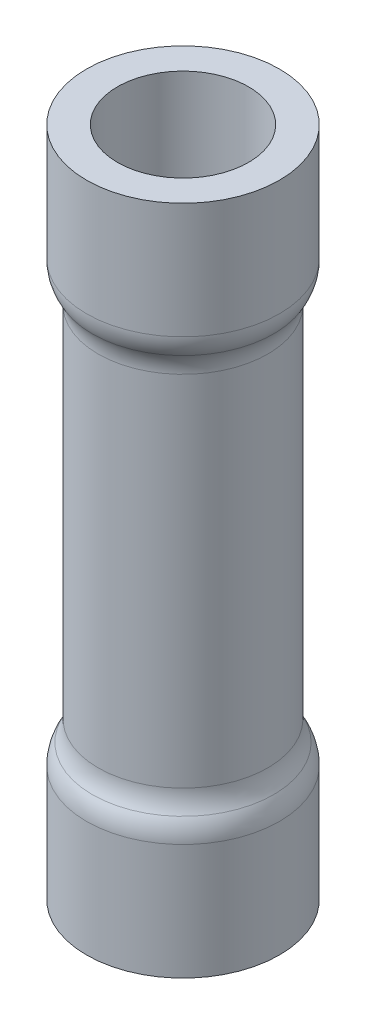
ISO-10303-21;
HEADER;
FILE_DESCRIPTION(('STEP AP214'),'2;1');
FILE_NAME('part.step','',(''),(''),'','','');
FILE_SCHEMA(('AUTOMOTIVE_DESIGN { 1 0 10303 214 1 1 1 1 }'));
ENDSEC;
DATA;
#1=APPLICATION_CONTEXT('core data for automotive mechanical design processes');
#2=APPLICATION_PROTOCOL_DEFINITION('international standard','automotive_design',2000,#1);
#3=PRODUCT_CONTEXT('',#1,'mechanical');
#4=PRODUCT('Part','Part','',(#3));
#5=PRODUCT_RELATED_PRODUCT_CATEGORY('part','',(#4));
#6=PRODUCT_DEFINITION_FORMATION('','',#4);
#7=PRODUCT_DEFINITION_CONTEXT('part definition',#1,'design');
#8=PRODUCT_DEFINITION('design','',#6,#7);
#9=PRODUCT_DEFINITION_SHAPE('','',#8);
#10=(LENGTH_UNIT() NAMED_UNIT(*) SI_UNIT(.MILLI.,.METRE.));
#11=(NAMED_UNIT(*) PLANE_ANGLE_UNIT() SI_UNIT($,.RADIAN.));
#12=(NAMED_UNIT(*) SI_UNIT($,.STERADIAN.) SOLID_ANGLE_UNIT());
#13=UNCERTAINTY_MEASURE_WITH_UNIT(LENGTH_MEASURE(1.E-05),#10,'distance_accuracy_value','');
#14=(GEOMETRIC_REPRESENTATION_CONTEXT(3) GLOBAL_UNCERTAINTY_ASSIGNED_CONTEXT((#13)) GLOBAL_UNIT_ASSIGNED_CONTEXT((#10,
#11,#12)) REPRESENTATION_CONTEXT('',''));
#15=CARTESIAN_POINT('',(0.,0.,0.));
#16=DIRECTION('',(0.,0.,1.));
#17=DIRECTION('',(1.,0.,0.));
#18=AXIS2_PLACEMENT_3D('',#15,#16,#17);
#19=CARTESIAN_POINT('',(0.,22.098,0.));
#20=DIRECTION('',(0.,1.,0.));
#21=DIRECTION('',(0.,0.,1.));
#22=AXIS2_PLACEMENT_3D('',#19,#20,#21);
#23=CYLINDRICAL_SURFACE('',#22,3.175);
#24=CARTESIAN_POINT('',(0.,22.098,0.));
#25=DIRECTION('',(0.,1.,0.));
#26=DIRECTION('',(0.,0.,1.));
#27=AXIS2_PLACEMENT_3D('',#24,#25,#26);
#28=CIRCLE('',#27,3.175);
#29=CARTESIAN_POINT('',(0.,22.098,3.175));
#30=VERTEX_POINT('',#29);
#31=EDGE_CURVE('E10',#30,#30,#28,.T.);
#32=ORIENTED_EDGE('',*,*,#31,.F.);
#33=EDGE_LOOP('',(#32));
#34=FACE_BOUND('',#33,.T.);
#35=CARTESIAN_POINT('',(0.,18.288,0.));
#36=DIRECTION('',(0.,1.,0.));
#37=DIRECTION('',(0.,0.,1.));
#38=AXIS2_PLACEMENT_3D('',#35,#36,#37);
#39=CIRCLE('',#38,3.175);
#40=CARTESIAN_POINT('',(0.,18.288,3.175));
#41=VERTEX_POINT('',#40);
#42=EDGE_CURVE('E84',#41,#41,#39,.T.);
#43=ORIENTED_EDGE('',*,*,#42,.T.);
#44=EDGE_LOOP('',(#43));
#45=FACE_BOUND('',#44,.T.);
#46=ADVANCED_FACE('F32',(#34,#45),#23,.T.);
#47=CARTESIAN_POINT('',(2.159,22.098,0.));
#48=DIRECTION('',(0.,1.,0.));
#49=DIRECTION('',(0.,0.,1.));
#50=AXIS2_PLACEMENT_3D('',#47,#48,#49);
#51=PLANE('',#50);
#52=ORIENTED_EDGE('',*,*,#31,.T.);
#53=EDGE_LOOP('',(#52));
#54=FACE_BOUND('',#53,.T.);
#55=CARTESIAN_POINT('',(0.,22.098,0.));
#56=DIRECTION('',(0.,1.,0.));
#57=DIRECTION('',(0.,0.,1.));
#58=AXIS2_PLACEMENT_3D('',#55,#56,#57);
#59=CIRCLE('',#58,2.159);
#60=CARTESIAN_POINT('',(0.,22.098,2.159));
#61=VERTEX_POINT('',#60);
#62=EDGE_CURVE('E38',#61,#61,#59,.T.);
#63=ORIENTED_EDGE('',*,*,#62,.F.);
#64=EDGE_LOOP('',(#63));
#65=FACE_BOUND('',#64,.T.);
#66=ADVANCED_FACE('F137',(#54,#65),#51,.T.);
#67=CARTESIAN_POINT('',(0.,22.098,0.));
#68=DIRECTION('',(0.,1.,0.));
#69=DIRECTION('',(0.,0.,1.));
#70=AXIS2_PLACEMENT_3D('',#67,#68,#69);
#71=CYLINDRICAL_SURFACE('',#70,2.159);
#72=ORIENTED_EDGE('',*,*,#62,.T.);
#73=EDGE_LOOP('',(#72));
#74=FACE_BOUND('',#73,.T.);
#75=CARTESIAN_POINT('',(0.,18.288,0.));
#76=DIRECTION('',(0.,1.,0.));
#77=DIRECTION('',(0.,0.,1.));
#78=AXIS2_PLACEMENT_3D('',#75,#76,#77);
#79=CIRCLE('',#78,2.159);
#80=CARTESIAN_POINT('',(0.,18.288,2.159));
#81=VERTEX_POINT('',#80);
#82=EDGE_CURVE('E42',#81,#81,#79,.T.);
#83=ORIENTED_EDGE('',*,*,#82,.F.);
#84=EDGE_LOOP('',(#83));
#85=FACE_BOUND('',#84,.T.);
#86=ADVANCED_FACE('F142',(#74,#85),#71,.F.);
#87=CARTESIAN_POINT('',(0.,18.288,0.));
#88=DIRECTION('',(0.,1.,0.));
#89=DIRECTION('',(0.,0.,1.));
#90=AXIS2_PLACEMENT_3D('',#87,#88,#89);
#91=TOROIDAL_SURFACE('',#90,1.905,0.253999999999999);
#92=ORIENTED_EDGE('',*,*,#82,.T.);
#93=EDGE_LOOP('',(#92));
#94=FACE_BOUND('',#93,.T.);
#95=CARTESIAN_POINT('',(0.,18.1541971973388,0.));
#96=DIRECTION('',(0.,1.,0.));
#97=DIRECTION('',(0.,0.,1.));
#98=AXIS2_PLACEMENT_3D('',#95,#96,#97);
#99=CIRCLE('',#98,2.1209);
#100=CARTESIAN_POINT('',(0.,18.1541971973388,2.1209));
#101=VERTEX_POINT('',#100);
#102=EDGE_CURVE('E46',#101,#101,#99,.T.);
#103=ORIENTED_EDGE('',*,*,#102,.F.);
#104=EDGE_LOOP('',(#103));
#105=FACE_BOUND('',#104,.T.);
#106=ADVANCED_FACE('F146',(#94,#105),#91,.F.);
#107=CARTESIAN_POINT('',(0.,16.9499719733877,0.));
#108=DIRECTION('',(0.,1.,0.));
#109=DIRECTION('',(0.,0.,1.));
#110=AXIS2_PLACEMENT_3D('',#107,#108,#109);
#111=TOROIDAL_SURFACE('',#110,4.064,2.286);
#112=ORIENTED_EDGE('',*,*,#102,.T.);
#113=EDGE_LOOP('',(#112));
#114=FACE_BOUND('',#113,.T.);
#115=CARTESIAN_POINT('',(0.,16.9499719733877,0.));
#116=DIRECTION('',(0.,1.,0.));
#117=DIRECTION('',(0.,0.,1.));
#118=AXIS2_PLACEMENT_3D('',#115,#116,#117);
#119=CIRCLE('',#118,1.778);
#120=CARTESIAN_POINT('',(0.,16.9499719733877,1.778));
#121=VERTEX_POINT('',#120);
#122=EDGE_CURVE('E51',#121,#121,#119,.T.);
#123=ORIENTED_EDGE('',*,*,#122,.F.);
#124=EDGE_LOOP('',(#123));
#125=FACE_BOUND('',#124,.T.);
#126=ADVANCED_FACE('F152',(#114,#125),#111,.T.);
#127=CARTESIAN_POINT('',(0.,22.098,0.));
#128=DIRECTION('',(0.,1.,0.));
#129=DIRECTION('',(0.,0.,1.));
#130=AXIS2_PLACEMENT_3D('',#127,#128,#129);
#131=CYLINDRICAL_SURFACE('',#130,1.778);
#132=ORIENTED_EDGE('',*,*,#122,.T.);
#133=EDGE_LOOP('',(#132));
#134=FACE_BOUND('',#133,.T.);
#135=CARTESIAN_POINT('',(0.,5.14802802661229,0.));
#136=DIRECTION('',(0.,1.,0.));
#137=DIRECTION('',(0.,0.,1.));
#138=AXIS2_PLACEMENT_3D('',#135,#136,#137);
#139=CIRCLE('',#138,1.778);
#140=CARTESIAN_POINT('',(0.,5.14802802661229,1.778));
#141=VERTEX_POINT('',#140);
#142=EDGE_CURVE('E54',#141,#141,#139,.T.);
#143=ORIENTED_EDGE('',*,*,#142,.F.);
#144=EDGE_LOOP('',(#143));
#145=FACE_BOUND('',#144,.T.);
#146=ADVANCED_FACE('F156',(#134,#145),#131,.F.);
#147=CARTESIAN_POINT('',(0.,5.14802802661229,0.));
#148=DIRECTION('',(0.,1.,0.));
#149=DIRECTION('',(0.,0.,1.));
#150=AXIS2_PLACEMENT_3D('',#147,#148,#149);
#151=TOROIDAL_SURFACE('',#150,4.064,2.286);
#152=ORIENTED_EDGE('',*,*,#142,.T.);
#153=EDGE_LOOP('',(#152));
#154=FACE_BOUND('',#153,.T.);
#155=CARTESIAN_POINT('',(0.,3.94380280266123,0.));
#156=DIRECTION('',(0.,1.,0.));
#157=DIRECTION('',(0.,0.,1.));
#158=AXIS2_PLACEMENT_3D('',#155,#156,#157);
#159=CIRCLE('',#158,2.1209);
#160=CARTESIAN_POINT('',(0.,3.94380280266123,2.1209));
#161=VERTEX_POINT('',#160);
#162=EDGE_CURVE('E57',#161,#161,#159,.T.);
#163=ORIENTED_EDGE('',*,*,#162,.F.);
#164=EDGE_LOOP('',(#163));
#165=FACE_BOUND('',#164,.T.);
#166=ADVANCED_FACE('F160',(#154,#165),#151,.T.);
#167=CARTESIAN_POINT('',(0.,3.81,0.));
#168=DIRECTION('',(0.,1.,0.));
#169=DIRECTION('',(0.,0.,1.));
#170=AXIS2_PLACEMENT_3D('',#167,#168,#169);
#171=TOROIDAL_SURFACE('',#170,1.905,0.254);
#172=ORIENTED_EDGE('',*,*,#162,.T.);
#173=EDGE_LOOP('',(#172));
#174=FACE_BOUND('',#173,.T.);
#175=CARTESIAN_POINT('',(0.,3.81,0.));
#176=DIRECTION('',(0.,1.,0.));
#177=DIRECTION('',(0.,0.,1.));
#178=AXIS2_PLACEMENT_3D('',#175,#176,#177);
#179=CIRCLE('',#178,2.159);
#180=CARTESIAN_POINT('',(0.,3.81,2.159));
#181=VERTEX_POINT('',#180);
#182=EDGE_CURVE('E60',#181,#181,#179,.T.);
#183=ORIENTED_EDGE('',*,*,#182,.F.);
#184=EDGE_LOOP('',(#183));
#185=FACE_BOUND('',#184,.T.);
#186=ADVANCED_FACE('F133',(#174,#185),#171,.F.);
#187=CARTESIAN_POINT('',(0.,22.098,0.));
#188=DIRECTION('',(0.,1.,0.));
#189=DIRECTION('',(0.,0.,1.));
#190=AXIS2_PLACEMENT_3D('',#187,#188,#189);
#191=CYLINDRICAL_SURFACE('',#190,2.159);
#192=ORIENTED_EDGE('',*,*,#182,.T.);
#193=EDGE_LOOP('',(#192));
#194=FACE_BOUND('',#193,.T.);
#195=CARTESIAN_POINT('',(0.,0.,0.));
#196=DIRECTION('',(0.,1.,0.));
#197=DIRECTION('',(0.,0.,1.));
#198=AXIS2_PLACEMENT_3D('',#195,#196,#197);
#199=CIRCLE('',#198,2.159);
#200=CARTESIAN_POINT('',(0.,0.,2.159));
#201=VERTEX_POINT('',#200);
#202=EDGE_CURVE('E63',#201,#201,#199,.T.);
#203=ORIENTED_EDGE('',*,*,#202,.F.);
#204=EDGE_LOOP('',(#203));
#205=FACE_BOUND('',#204,.T.);
#206=ADVANCED_FACE('F127',(#194,#205),#191,.F.);
#207=CARTESIAN_POINT('',(3.175,0.,0.));
#208=DIRECTION('',(0.,-1.,0.));
#209=DIRECTION('',(0.,0.,-1.));
#210=AXIS2_PLACEMENT_3D('',#207,#208,#209);
#211=PLANE('',#210);
#212=ORIENTED_EDGE('',*,*,#202,.T.);
#213=EDGE_LOOP('',(#212));
#214=FACE_BOUND('',#213,.T.);
#215=CARTESIAN_POINT('',(0.,0.,0.));
#216=DIRECTION('',(0.,1.,0.));
#217=DIRECTION('',(0.,0.,1.));
#218=AXIS2_PLACEMENT_3D('',#215,#216,#217);
#219=CIRCLE('',#218,3.175);
#220=CARTESIAN_POINT('',(0.,0.,3.175));
#221=VERTEX_POINT('',#220);
#222=EDGE_CURVE('E66',#221,#221,#219,.T.);
#223=ORIENTED_EDGE('',*,*,#222,.F.);
#224=EDGE_LOOP('',(#223));
#225=FACE_BOUND('',#224,.T.);
#226=ADVANCED_FACE('F122',(#214,#225),#211,.T.);
#227=CARTESIAN_POINT('',(0.,22.098,0.));
#228=DIRECTION('',(0.,1.,0.));
#229=DIRECTION('',(0.,0.,1.));
#230=AXIS2_PLACEMENT_3D('',#227,#228,#229);
#231=CYLINDRICAL_SURFACE('',#230,3.175);
#232=CARTESIAN_POINT('',(0.,3.81,0.));
#233=DIRECTION('',(0.,1.,0.));
#234=DIRECTION('',(0.,0.,1.));
#235=AXIS2_PLACEMENT_3D('',#232,#233,#234);
#236=CIRCLE('',#235,3.175);
#237=CARTESIAN_POINT('',(0.,3.81,3.175));
#238=VERTEX_POINT('',#237);
#239=EDGE_CURVE('E69',#238,#238,#236,.T.);
#240=ORIENTED_EDGE('',*,*,#239,.F.);
#241=EDGE_LOOP('',(#240));
#242=FACE_BOUND('',#241,.T.);
#243=ORIENTED_EDGE('',*,*,#222,.T.);
#244=EDGE_LOOP('',(#243));
#245=FACE_BOUND('',#244,.T.);
#246=ADVANCED_FACE('F116',(#242,#245),#231,.T.);
#247=CARTESIAN_POINT('',(0.,3.81,0.));
#248=DIRECTION('',(0.,1.,0.));
#249=DIRECTION('',(0.,0.,1.));
#250=AXIS2_PLACEMENT_3D('',#247,#248,#249);
#251=TOROIDAL_SURFACE('',#250,1.905,1.27);
#252=CARTESIAN_POINT('',(0.,4.47901401330614,0.));
#253=DIRECTION('',(0.,1.,0.));
#254=DIRECTION('',(0.,0.,1.));
#255=AXIS2_PLACEMENT_3D('',#252,#253,#254);
#256=CIRCLE('',#255,2.9845);
#257=CARTESIAN_POINT('',(0.,4.47901401330614,2.9845));
#258=VERTEX_POINT('',#257);
#259=EDGE_CURVE('E72',#258,#258,#256,.T.);
#260=ORIENTED_EDGE('',*,*,#259,.F.);
#261=EDGE_LOOP('',(#260));
#262=FACE_BOUND('',#261,.T.);
#263=ORIENTED_EDGE('',*,*,#239,.T.);
#264=EDGE_LOOP('',(#263));
#265=FACE_BOUND('',#264,.T.);
#266=ADVANCED_FACE('F110',(#262,#265),#251,.T.);
#267=CARTESIAN_POINT('',(0.,5.14802802661229,0.));
#268=DIRECTION('',(0.,1.,0.));
#269=DIRECTION('',(0.,0.,1.));
#270=AXIS2_PLACEMENT_3D('',#267,#268,#269);
#271=TOROIDAL_SURFACE('',#270,4.064,1.27);
#272=CARTESIAN_POINT('',(0.,5.14802802661229,0.));
#273=DIRECTION('',(0.,1.,0.));
#274=DIRECTION('',(0.,0.,1.));
#275=AXIS2_PLACEMENT_3D('',#272,#273,#274);
#276=CIRCLE('',#275,2.794);
#277=CARTESIAN_POINT('',(0.,5.14802802661229,2.794));
#278=VERTEX_POINT('',#277);
#279=EDGE_CURVE('E75',#278,#278,#276,.T.);
#280=ORIENTED_EDGE('',*,*,#279,.F.);
#281=EDGE_LOOP('',(#280));
#282=FACE_BOUND('',#281,.T.);
#283=ORIENTED_EDGE('',*,*,#259,.T.);
#284=EDGE_LOOP('',(#283));
#285=FACE_BOUND('',#284,.T.);
#286=ADVANCED_FACE('F104',(#282,#285),#271,.F.);
#287=CARTESIAN_POINT('',(0.,22.098,0.));
#288=DIRECTION('',(0.,1.,0.));
#289=DIRECTION('',(0.,0.,1.));
#290=AXIS2_PLACEMENT_3D('',#287,#288,#289);
#291=CYLINDRICAL_SURFACE('',#290,2.794);
#292=CARTESIAN_POINT('',(0.,16.9499719733877,0.));
#293=DIRECTION('',(0.,1.,0.));
#294=DIRECTION('',(0.,0.,1.));
#295=AXIS2_PLACEMENT_3D('',#292,#293,#294);
#296=CIRCLE('',#295,2.794);
#297=CARTESIAN_POINT('',(0.,16.9499719733877,2.794));
#298=VERTEX_POINT('',#297);
#299=EDGE_CURVE('E78',#298,#298,#296,.T.);
#300=ORIENTED_EDGE('',*,*,#299,.F.);
#301=EDGE_LOOP('',(#300));
#302=FACE_BOUND('',#301,.T.);
#303=ORIENTED_EDGE('',*,*,#279,.T.);
#304=EDGE_LOOP('',(#303));
#305=FACE_BOUND('',#304,.T.);
#306=ADVANCED_FACE('F98',(#302,#305),#291,.T.);
#307=CARTESIAN_POINT('',(0.,16.9499719733877,0.));
#308=DIRECTION('',(0.,1.,0.));
#309=DIRECTION('',(0.,0.,1.));
#310=AXIS2_PLACEMENT_3D('',#307,#308,#309);
#311=TOROIDAL_SURFACE('',#310,4.064,1.27);
#312=CARTESIAN_POINT('',(0.,17.6189859866939,0.));
#313=DIRECTION('',(0.,1.,0.));
#314=DIRECTION('',(0.,0.,1.));
#315=AXIS2_PLACEMENT_3D('',#312,#313,#314);
#316=CIRCLE('',#315,2.9845);
#317=CARTESIAN_POINT('',(0.,17.6189859866939,2.9845));
#318=VERTEX_POINT('',#317);
#319=EDGE_CURVE('E81',#318,#318,#316,.T.);
#320=ORIENTED_EDGE('',*,*,#319,.F.);
#321=EDGE_LOOP('',(#320));
#322=FACE_BOUND('',#321,.T.);
#323=ORIENTED_EDGE('',*,*,#299,.T.);
#324=EDGE_LOOP('',(#323));
#325=FACE_BOUND('',#324,.T.);
#326=ADVANCED_FACE('F92',(#322,#325),#311,.F.);
#327=CARTESIAN_POINT('',(0.,18.288,0.));
#328=DIRECTION('',(0.,1.,0.));
#329=DIRECTION('',(0.,0.,1.));
#330=AXIS2_PLACEMENT_3D('',#327,#328,#329);
#331=TOROIDAL_SURFACE('',#330,1.905,1.27);
#332=ORIENTED_EDGE('',*,*,#42,.F.);
#333=EDGE_LOOP('',(#332));
#334=FACE_BOUND('',#333,.T.);
#335=ORIENTED_EDGE('',*,*,#319,.T.);
#336=EDGE_LOOP('',(#335));
#337=FACE_BOUND('',#336,.T.);
#338=ADVANCED_FACE('F89',(#334,#337),#331,.T.);
#339=CLOSED_SHELL('',(#46,#66,#86,#106,#126,#146,#166,#186,#206,#226,#246,#266,#286,#306,#326,#338));
#340=MANIFOLD_SOLID_BREP('B2',#339);
#341=ADVANCED_BREP_SHAPE_REPRESENTATION('',(#18,#340),#14);
#342=SHAPE_DEFINITION_REPRESENTATION(#9,#341);
ENDSEC;
END-ISO-10303-21;
